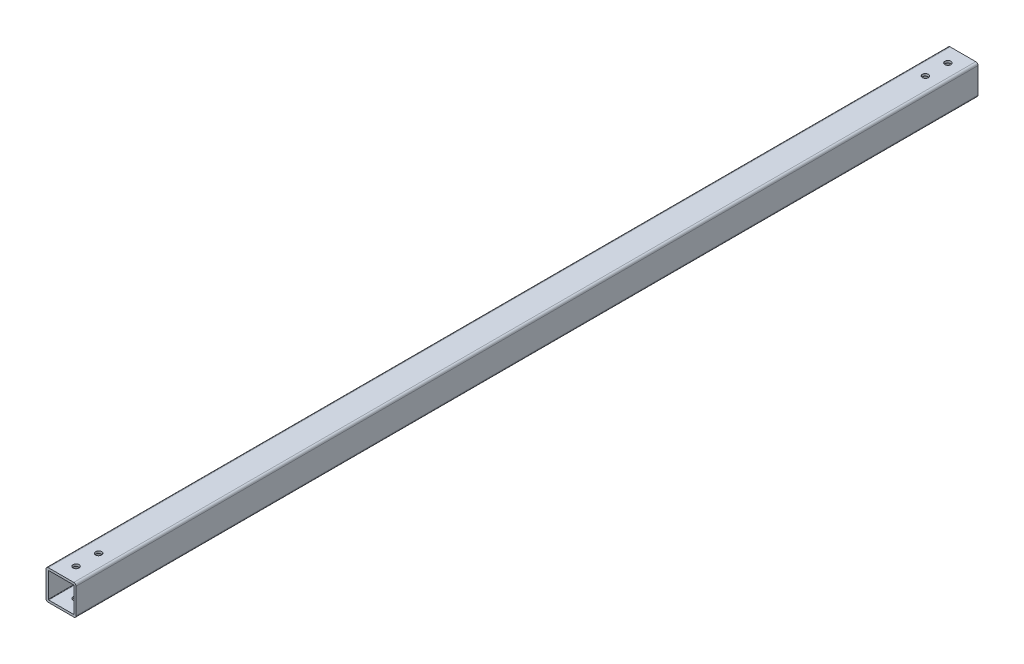
ISO-10303-21;
HEADER;
FILE_DESCRIPTION(('STEP AP214'),'2;1');
FILE_NAME('part.step','',(''),(''),'','','');
FILE_SCHEMA(('AUTOMOTIVE_DESIGN { 1 0 10303 214 1 1 1 1 }'));
ENDSEC;
DATA;
#1=APPLICATION_CONTEXT('core data for automotive mechanical design processes');
#2=APPLICATION_PROTOCOL_DEFINITION('international standard','automotive_design',2000,#1);
#3=PRODUCT_CONTEXT('',#1,'mechanical');
#4=PRODUCT('Part','Part','',(#3));
#5=PRODUCT_RELATED_PRODUCT_CATEGORY('part','',(#4));
#6=PRODUCT_DEFINITION_FORMATION('','',#4);
#7=PRODUCT_DEFINITION_CONTEXT('part definition',#1,'design');
#8=PRODUCT_DEFINITION('design','',#6,#7);
#9=PRODUCT_DEFINITION_SHAPE('','',#8);
#10=(LENGTH_UNIT() NAMED_UNIT(*) SI_UNIT(.MILLI.,.METRE.));
#11=(NAMED_UNIT(*) PLANE_ANGLE_UNIT() SI_UNIT($,.RADIAN.));
#12=(NAMED_UNIT(*) SI_UNIT($,.STERADIAN.) SOLID_ANGLE_UNIT());
#13=UNCERTAINTY_MEASURE_WITH_UNIT(LENGTH_MEASURE(1.E-05),#10,'distance_accuracy_value','');
#14=(GEOMETRIC_REPRESENTATION_CONTEXT(3) GLOBAL_UNCERTAINTY_ASSIGNED_CONTEXT((#13)) GLOBAL_UNIT_ASSIGNED_CONTEXT((#10,
#11,#12)) REPRESENTATION_CONTEXT('',''));
#15=CARTESIAN_POINT('',(0.,0.,0.));
#16=DIRECTION('',(0.,0.,1.));
#17=DIRECTION('',(1.,0.,0.));
#18=AXIS2_PLACEMENT_3D('',#15,#16,#17);
#19=CARTESIAN_POINT('',(0.,0.,1200.));
#20=DIRECTION('',(0.,0.,1.));
#21=DIRECTION('',(1.,0.,0.));
#22=AXIS2_PLACEMENT_3D('',#19,#20,#21);
#23=PLANE('',#22);
#24=DIRECTION('',(1.,0.,0.));
#25=VECTOR('',#24,1.);
#26=CARTESIAN_POINT('',(-20.0000000000001,-20.,1200.));
#27=LINE('',#26,#25);
#28=CARTESIAN_POINT('',(-17.0000000000001,-20.,1200.));
#29=VERTEX_POINT('',#28);
#30=CARTESIAN_POINT('',(17.,-20.,1200.));
#31=VERTEX_POINT('',#30);
#32=EDGE_CURVE('E210',#29,#31,#27,.T.);
#33=ORIENTED_EDGE('',*,*,#32,.T.);
#34=CARTESIAN_POINT('',(17.,-17.,1200.));
#35=DIRECTION('',(0.,0.,1.));
#36=DIRECTION('',(1.,0.,0.));
#37=AXIS2_PLACEMENT_3D('',#34,#35,#36);
#38=CIRCLE('',#37,3.);
#39=CARTESIAN_POINT('',(20.,-17.,1200.));
#40=VERTEX_POINT('',#39);
#41=EDGE_CURVE('E269',#31,#40,#38,.T.);
#42=ORIENTED_EDGE('',*,*,#41,.T.);
#43=DIRECTION('',(0.,1.,0.));
#44=VECTOR('',#43,1.);
#45=CARTESIAN_POINT('',(20.,20.,1200.));
#46=LINE('',#45,#44);
#47=CARTESIAN_POINT('',(20.,17.,1200.));
#48=VERTEX_POINT('',#47);
#49=EDGE_CURVE('E335',#40,#48,#46,.T.);
#50=ORIENTED_EDGE('',*,*,#49,.T.);
#51=CARTESIAN_POINT('',(17.,17.,1200.));
#52=DIRECTION('',(0.,0.,1.));
#53=DIRECTION('',(1.,0.,0.));
#54=AXIS2_PLACEMENT_3D('',#51,#52,#53);
#55=CIRCLE('',#54,3.);
#56=CARTESIAN_POINT('',(17.,20.,1200.));
#57=VERTEX_POINT('',#56);
#58=EDGE_CURVE('E265',#48,#57,#55,.T.);
#59=ORIENTED_EDGE('',*,*,#58,.T.);
#60=DIRECTION('',(-1.,0.,0.));
#61=VECTOR('',#60,1.);
#62=CARTESIAN_POINT('',(-20.0000000000001,20.,1200.));
#63=LINE('',#62,#61);
#64=CARTESIAN_POINT('',(-17.0000000000001,20.,1200.));
#65=VERTEX_POINT('',#64);
#66=EDGE_CURVE('E338',#57,#65,#63,.T.);
#67=ORIENTED_EDGE('',*,*,#66,.T.);
#68=CARTESIAN_POINT('',(-17.0000000000001,17.,1200.));
#69=DIRECTION('',(0.,0.,1.));
#70=DIRECTION('',(1.,0.,0.));
#71=AXIS2_PLACEMENT_3D('',#68,#69,#70);
#72=CIRCLE('',#71,3.);
#73=CARTESIAN_POINT('',(-20.0000000000001,17.,1200.));
#74=VERTEX_POINT('',#73);
#75=EDGE_CURVE('E91',#65,#74,#72,.T.);
#76=ORIENTED_EDGE('',*,*,#75,.T.);
#77=DIRECTION('',(0.,-1.,0.));
#78=VECTOR('',#77,1.);
#79=CARTESIAN_POINT('',(-20.0000000000001,20.,1200.));
#80=LINE('',#79,#78);
#81=CARTESIAN_POINT('',(-20.0000000000001,-17.,1200.));
#82=VERTEX_POINT('',#81);
#83=EDGE_CURVE('E215',#74,#82,#80,.T.);
#84=ORIENTED_EDGE('',*,*,#83,.T.);
#85=CARTESIAN_POINT('',(-17.0000000000001,-17.,1200.));
#86=DIRECTION('',(0.,0.,1.));
#87=DIRECTION('',(1.,0.,0.));
#88=AXIS2_PLACEMENT_3D('',#85,#86,#87);
#89=CIRCLE('',#88,3.);
#90=EDGE_CURVE('E267',#82,#29,#89,.T.);
#91=ORIENTED_EDGE('',*,*,#90,.T.);
#92=EDGE_LOOP('',(#33,#42,#50,#59,#67,#76,#84,#91));
#93=FACE_BOUND('',#92,.T.);
#94=DIRECTION('',(-1.,0.,0.));
#95=VECTOR('',#94,1.);
#96=CARTESIAN_POINT('',(-20.0000000000001,17.,1200.));
#97=LINE('',#96,#95);
#98=CARTESIAN_POINT('',(16.5,17.,1200.));
#99=VERTEX_POINT('',#98);
#100=CARTESIAN_POINT('',(-16.5000000000001,17.,1200.));
#101=VERTEX_POINT('',#100);
#102=EDGE_CURVE('E322',#99,#101,#97,.T.);
#103=ORIENTED_EDGE('',*,*,#102,.F.);
#104=CARTESIAN_POINT('',(16.5,16.5,1200.));
#105=DIRECTION('',(0.,0.,1.));
#106=DIRECTION('',(1.,0.,0.));
#107=AXIS2_PLACEMENT_3D('',#104,#105,#106);
#108=CIRCLE('',#107,0.5);
#109=CARTESIAN_POINT('',(17.,16.5,1200.));
#110=VERTEX_POINT('',#109);
#111=EDGE_CURVE('E240',#99,#110,#108,.F.);
#112=ORIENTED_EDGE('',*,*,#111,.T.);
#113=DIRECTION('',(0.,1.,0.));
#114=VECTOR('',#113,1.);
#115=CARTESIAN_POINT('',(17.,20.,1200.));
#116=LINE('',#115,#114);
#117=CARTESIAN_POINT('',(17.,-16.5,1200.));
#118=VERTEX_POINT('',#117);
#119=EDGE_CURVE('E319',#118,#110,#116,.T.);
#120=ORIENTED_EDGE('',*,*,#119,.F.);
#121=CARTESIAN_POINT('',(16.5,-16.5,1200.));
#122=DIRECTION('',(0.,0.,1.));
#123=DIRECTION('',(1.,0.,0.));
#124=AXIS2_PLACEMENT_3D('',#121,#122,#123);
#125=CIRCLE('',#124,0.5);
#126=CARTESIAN_POINT('',(16.5,-17.,1200.));
#127=VERTEX_POINT('',#126);
#128=EDGE_CURVE('E244',#118,#127,#125,.F.);
#129=ORIENTED_EDGE('',*,*,#128,.T.);
#130=DIRECTION('',(1.,0.,0.));
#131=VECTOR('',#130,1.);
#132=CARTESIAN_POINT('',(-20.0000000000001,-17.,1200.));
#133=LINE('',#132,#131);
#134=CARTESIAN_POINT('',(-16.5000000000001,-17.,1200.));
#135=VERTEX_POINT('',#134);
#136=EDGE_CURVE('E327',#135,#127,#133,.T.);
#137=ORIENTED_EDGE('',*,*,#136,.F.);
#138=CARTESIAN_POINT('',(-16.5000000000001,-16.5,1200.));
#139=DIRECTION('',(0.,0.,1.));
#140=DIRECTION('',(1.,0.,0.));
#141=AXIS2_PLACEMENT_3D('',#138,#139,#140);
#142=CIRCLE('',#141,0.5);
#143=CARTESIAN_POINT('',(-17.0000000000001,-16.5,1200.));
#144=VERTEX_POINT('',#143);
#145=EDGE_CURVE('E196',#135,#144,#142,.F.);
#146=ORIENTED_EDGE('',*,*,#145,.T.);
#147=DIRECTION('',(0.,-1.,0.));
#148=VECTOR('',#147,1.);
#149=CARTESIAN_POINT('',(-17.0000000000001,20.,1200.));
#150=LINE('',#149,#148);
#151=CARTESIAN_POINT('',(-17.0000000000001,16.5,1200.));
#152=VERTEX_POINT('',#151);
#153=EDGE_CURVE('E325',#152,#144,#150,.T.);
#154=ORIENTED_EDGE('',*,*,#153,.F.);
#155=CARTESIAN_POINT('',(-16.5000000000001,16.5,1200.));
#156=DIRECTION('',(0.,0.,1.));
#157=DIRECTION('',(1.,0.,0.));
#158=AXIS2_PLACEMENT_3D('',#155,#156,#157);
#159=CIRCLE('',#158,0.5);
#160=EDGE_CURVE('E195',#152,#101,#159,.F.);
#161=ORIENTED_EDGE('',*,*,#160,.T.);
#162=EDGE_LOOP('',(#103,#112,#120,#129,#137,#146,#154,#161));
#163=FACE_BOUND('',#162,.T.);
#164=ADVANCED_FACE('F67',(#93,#163),#23,.T.);
#165=CARTESIAN_POINT('',(0.,0.,0.));
#166=DIRECTION('',(0.,0.,1.));
#167=DIRECTION('',(1.,0.,0.));
#168=AXIS2_PLACEMENT_3D('',#165,#166,#167);
#169=PLANE('',#168);
#170=DIRECTION('',(0.,1.,0.));
#171=VECTOR('',#170,1.);
#172=CARTESIAN_POINT('',(20.,20.,0.));
#173=LINE('',#172,#171);
#174=CARTESIAN_POINT('',(20.,-17.,0.));
#175=VERTEX_POINT('',#174);
#176=CARTESIAN_POINT('',(20.,17.,0.));
#177=VERTEX_POINT('',#176);
#178=EDGE_CURVE('E330',#175,#177,#173,.T.);
#179=ORIENTED_EDGE('',*,*,#178,.F.);
#180=CARTESIAN_POINT('',(17.,-17.,0.));
#181=DIRECTION('',(0.,0.,1.));
#182=DIRECTION('',(1.,0.,0.));
#183=AXIS2_PLACEMENT_3D('',#180,#181,#182);
#184=CIRCLE('',#183,3.);
#185=CARTESIAN_POINT('',(17.,-20.,0.));
#186=VERTEX_POINT('',#185);
#187=EDGE_CURVE('E257',#175,#186,#184,.F.);
#188=ORIENTED_EDGE('',*,*,#187,.T.);
#189=DIRECTION('',(1.,0.,0.));
#190=VECTOR('',#189,1.);
#191=CARTESIAN_POINT('',(-20.,-20.,0.));
#192=LINE('',#191,#190);
#193=CARTESIAN_POINT('',(-17.,-20.,0.));
#194=VERTEX_POINT('',#193);
#195=EDGE_CURVE('E218',#194,#186,#192,.T.);
#196=ORIENTED_EDGE('',*,*,#195,.F.);
#197=CARTESIAN_POINT('',(-17.,-17.,0.));
#198=DIRECTION('',(0.,0.,1.));
#199=DIRECTION('',(1.,0.,0.));
#200=AXIS2_PLACEMENT_3D('',#197,#198,#199);
#201=CIRCLE('',#200,3.);
#202=CARTESIAN_POINT('',(-20.,-17.,0.));
#203=VERTEX_POINT('',#202);
#204=EDGE_CURVE('E255',#194,#203,#201,.F.);
#205=ORIENTED_EDGE('',*,*,#204,.T.);
#206=DIRECTION('',(0.,-1.,0.));
#207=VECTOR('',#206,1.);
#208=CARTESIAN_POINT('',(-20.,20.,0.));
#209=LINE('',#208,#207);
#210=CARTESIAN_POINT('',(-20.,17.,0.));
#211=VERTEX_POINT('',#210);
#212=EDGE_CURVE('E345',#211,#203,#209,.T.);
#213=ORIENTED_EDGE('',*,*,#212,.F.);
#214=CARTESIAN_POINT('',(-17.,17.,0.));
#215=DIRECTION('',(0.,0.,1.));
#216=DIRECTION('',(1.,0.,0.));
#217=AXIS2_PLACEMENT_3D('',#214,#215,#216);
#218=CIRCLE('',#217,3.);
#219=CARTESIAN_POINT('',(-17.,20.,0.));
#220=VERTEX_POINT('',#219);
#221=EDGE_CURVE('E251',#211,#220,#218,.F.);
#222=ORIENTED_EDGE('',*,*,#221,.T.);
#223=DIRECTION('',(-1.,0.,0.));
#224=VECTOR('',#223,1.);
#225=CARTESIAN_POINT('',(-20.,20.,0.));
#226=LINE('',#225,#224);
#227=CARTESIAN_POINT('',(17.,20.,0.));
#228=VERTEX_POINT('',#227);
#229=EDGE_CURVE('E343',#228,#220,#226,.T.);
#230=ORIENTED_EDGE('',*,*,#229,.F.);
#231=CARTESIAN_POINT('',(17.,17.,0.));
#232=DIRECTION('',(0.,0.,1.));
#233=DIRECTION('',(1.,0.,0.));
#234=AXIS2_PLACEMENT_3D('',#231,#232,#233);
#235=CIRCLE('',#234,3.);
#236=EDGE_CURVE('E253',#228,#177,#235,.F.);
#237=ORIENTED_EDGE('',*,*,#236,.T.);
#238=EDGE_LOOP('',(#179,#188,#196,#205,#213,#222,#230,#237));
#239=FACE_BOUND('',#238,.T.);
#240=DIRECTION('',(1.,0.,0.));
#241=VECTOR('',#240,1.);
#242=CARTESIAN_POINT('',(-20.,-17.,0.));
#243=LINE('',#242,#241);
#244=CARTESIAN_POINT('',(-16.5,-17.,0.));
#245=VERTEX_POINT('',#244);
#246=CARTESIAN_POINT('',(16.5,-17.,0.));
#247=VERTEX_POINT('',#246);
#248=EDGE_CURVE('E206',#245,#247,#243,.T.);
#249=ORIENTED_EDGE('',*,*,#248,.T.);
#250=CARTESIAN_POINT('',(16.5,-16.5,0.));
#251=DIRECTION('',(0.,0.,1.));
#252=DIRECTION('',(1.,0.,0.));
#253=AXIS2_PLACEMENT_3D('',#250,#251,#252);
#254=CIRCLE('',#253,0.5);
#255=CARTESIAN_POINT('',(17.,-16.5,0.));
#256=VERTEX_POINT('',#255);
#257=EDGE_CURVE('E242',#247,#256,#254,.T.);
#258=ORIENTED_EDGE('',*,*,#257,.T.);
#259=DIRECTION('',(0.,1.,0.));
#260=VECTOR('',#259,1.);
#261=CARTESIAN_POINT('',(17.,20.,0.));
#262=LINE('',#261,#260);
#263=CARTESIAN_POINT('',(17.,16.5,0.));
#264=VERTEX_POINT('',#263);
#265=EDGE_CURVE('E318',#256,#264,#262,.T.);
#266=ORIENTED_EDGE('',*,*,#265,.T.);
#267=CARTESIAN_POINT('',(16.5,16.5,0.));
#268=DIRECTION('',(0.,0.,1.));
#269=DIRECTION('',(1.,0.,0.));
#270=AXIS2_PLACEMENT_3D('',#267,#268,#269);
#271=CIRCLE('',#270,0.5);
#272=CARTESIAN_POINT('',(16.5,17.,0.));
#273=VERTEX_POINT('',#272);
#274=EDGE_CURVE('E238',#264,#273,#271,.T.);
#275=ORIENTED_EDGE('',*,*,#274,.T.);
#276=DIRECTION('',(-1.,0.,0.));
#277=VECTOR('',#276,1.);
#278=CARTESIAN_POINT('',(-20.,17.,0.));
#279=LINE('',#278,#277);
#280=CARTESIAN_POINT('',(-16.5,17.,0.));
#281=VERTEX_POINT('',#280);
#282=EDGE_CURVE('E190',#273,#281,#279,.T.);
#283=ORIENTED_EDGE('',*,*,#282,.T.);
#284=CARTESIAN_POINT('',(-16.5,16.5,0.));
#285=DIRECTION('',(0.,0.,1.));
#286=DIRECTION('',(1.,0.,0.));
#287=AXIS2_PLACEMENT_3D('',#284,#285,#286);
#288=CIRCLE('',#287,0.5);
#289=CARTESIAN_POINT('',(-17.,16.5,0.));
#290=VERTEX_POINT('',#289);
#291=EDGE_CURVE('E184',#281,#290,#288,.T.);
#292=ORIENTED_EDGE('',*,*,#291,.T.);
#293=DIRECTION('',(0.,-1.,0.));
#294=VECTOR('',#293,1.);
#295=CARTESIAN_POINT('',(-17.,20.,0.));
#296=LINE('',#295,#294);
#297=CARTESIAN_POINT('',(-17.,-16.5,0.));
#298=VERTEX_POINT('',#297);
#299=EDGE_CURVE('E188',#290,#298,#296,.T.);
#300=ORIENTED_EDGE('',*,*,#299,.T.);
#301=CARTESIAN_POINT('',(-16.5,-16.5,0.));
#302=DIRECTION('',(0.,0.,1.));
#303=DIRECTION('',(1.,0.,0.));
#304=AXIS2_PLACEMENT_3D('',#301,#302,#303);
#305=CIRCLE('',#304,0.5);
#306=EDGE_CURVE('E234',#298,#245,#305,.T.);
#307=ORIENTED_EDGE('',*,*,#306,.T.);
#308=EDGE_LOOP('',(#249,#258,#266,#275,#283,#292,#300,#307));
#309=FACE_BOUND('',#308,.T.);
#310=ADVANCED_FACE('F187',(#239,#309),#169,.F.);
#311=CARTESIAN_POINT('',(20.,20.,1200.));
#312=DIRECTION('',(-1.,0.,0.));
#313=DIRECTION('',(0.,-1.,0.));
#314=AXIS2_PLACEMENT_3D('',#311,#312,#313);
#315=PLANE('',#314);
#316=ORIENTED_EDGE('',*,*,#49,.F.);
#317=DIRECTION('',(0.,0.,-1.));
#318=VECTOR('',#317,1.);
#319=CARTESIAN_POINT('',(20.,-17.,1200.));
#320=LINE('',#319,#318);
#321=EDGE_CURVE('E248',#40,#175,#320,.T.);
#322=ORIENTED_EDGE('',*,*,#321,.T.);
#323=ORIENTED_EDGE('',*,*,#178,.T.);
#324=DIRECTION('',(0.,0.,-1.));
#325=VECTOR('',#324,1.);
#326=CARTESIAN_POINT('',(20.,17.,1200.));
#327=LINE('',#326,#325);
#328=EDGE_CURVE('E246',#177,#48,#327,.F.);
#329=ORIENTED_EDGE('',*,*,#328,.T.);
#330=EDGE_LOOP('',(#316,#322,#323,#329));
#331=FACE_BOUND('',#330,.T.);
#332=ADVANCED_FACE('F363',(#331),#315,.F.);
#333=CARTESIAN_POINT('',(-20.0000000000001,20.,1200.));
#334=DIRECTION('',(0.,-1.,0.));
#335=DIRECTION('',(0.,0.,-1.));
#336=AXIS2_PLACEMENT_3D('',#333,#334,#335);
#337=PLANE('',#336);
#338=CARTESIAN_POINT('',(0.,20.,50.));
#339=DIRECTION('',(0.,1.,0.));
#340=DIRECTION('',(0.,0.,-1.));
#341=AXIS2_PLACEMENT_3D('',#338,#339,#340);
#342=CIRCLE('',#341,4.);
#343=CARTESIAN_POINT('',(0.,20.,46.));
#344=VERTEX_POINT('',#343);
#345=EDGE_CURVE('E485',#344,#344,#342,.T.);
#346=ORIENTED_EDGE('',*,*,#345,.F.);
#347=EDGE_LOOP('',(#346));
#348=FACE_BOUND('',#347,.T.);
#349=CARTESIAN_POINT('',(0.,20.,1150.));
#350=DIRECTION('',(0.,1.,0.));
#351=DIRECTION('',(0.,0.,1.));
#352=AXIS2_PLACEMENT_3D('',#349,#350,#351);
#353=CIRCLE('',#352,4.);
#354=CARTESIAN_POINT('',(0.,20.,1154.));
#355=VERTEX_POINT('',#354);
#356=EDGE_CURVE('E295',#355,#355,#353,.T.);
#357=ORIENTED_EDGE('',*,*,#356,.F.);
#358=EDGE_LOOP('',(#357));
#359=FACE_BOUND('',#358,.T.);
#360=CARTESIAN_POINT('',(0.,20.,1180.));
#361=DIRECTION('',(0.,1.,0.));
#362=DIRECTION('',(0.,0.,1.));
#363=AXIS2_PLACEMENT_3D('',#360,#361,#362);
#364=CIRCLE('',#363,3.99999999999999);
#365=CARTESIAN_POINT('',(0.,20.,1184.));
#366=VERTEX_POINT('',#365);
#367=EDGE_CURVE('E292',#366,#366,#364,.T.);
#368=ORIENTED_EDGE('',*,*,#367,.F.);
#369=EDGE_LOOP('',(#368));
#370=FACE_BOUND('',#369,.T.);
#371=CARTESIAN_POINT('',(0.,20.,20.));
#372=DIRECTION('',(0.,1.,0.));
#373=DIRECTION('',(0.,0.,1.));
#374=AXIS2_PLACEMENT_3D('',#371,#372,#373);
#375=CIRCLE('',#374,3.99999999999999);
#376=CARTESIAN_POINT('',(0.,20.,24.));
#377=VERTEX_POINT('',#376);
#378=EDGE_CURVE('E311',#377,#377,#375,.T.);
#379=ORIENTED_EDGE('',*,*,#378,.F.);
#380=EDGE_LOOP('',(#379));
#381=FACE_BOUND('',#380,.T.);
#382=ORIENTED_EDGE('',*,*,#66,.F.);
#383=DIRECTION('',(0.,0.,-1.));
#384=VECTOR('',#383,1.);
#385=CARTESIAN_POINT('',(17.,20.,1200.));
#386=LINE('',#385,#384);
#387=EDGE_CURVE('E14',#57,#228,#386,.T.);
#388=ORIENTED_EDGE('',*,*,#387,.T.);
#389=ORIENTED_EDGE('',*,*,#229,.T.);
#390=DIRECTION('',(0.,0.,-1.));
#391=VECTOR('',#390,1.);
#392=CARTESIAN_POINT('',(-17.0000000000001,20.,1200.));
#393=LINE('',#392,#391);
#394=EDGE_CURVE('E76',#220,#65,#393,.F.);
#395=ORIENTED_EDGE('',*,*,#394,.T.);
#396=EDGE_LOOP('',(#382,#388,#389,#395));
#397=FACE_BOUND('',#396,.T.);
#398=ADVANCED_FACE('F371',(#348,#359,#370,#381,#397),#337,.F.);
#399=CARTESIAN_POINT('',(-20.0000000000001,20.,1200.));
#400=DIRECTION('',(1.,0.,0.));
#401=DIRECTION('',(0.,1.,0.));
#402=AXIS2_PLACEMENT_3D('',#399,#400,#401);
#403=PLANE('',#402);
#404=ORIENTED_EDGE('',*,*,#212,.T.);
#405=DIRECTION('',(0.,0.,-1.));
#406=VECTOR('',#405,1.);
#407=CARTESIAN_POINT('',(-20.0000000000001,-17.,1200.));
#408=LINE('',#407,#406);
#409=EDGE_CURVE('E84',#203,#82,#408,.F.);
#410=ORIENTED_EDGE('',*,*,#409,.T.);
#411=ORIENTED_EDGE('',*,*,#83,.F.);
#412=DIRECTION('',(0.,0.,-1.));
#413=VECTOR('',#412,1.);
#414=CARTESIAN_POINT('',(-20.0000000000001,17.,1200.));
#415=LINE('',#414,#413);
#416=EDGE_CURVE('E271',#74,#211,#415,.T.);
#417=ORIENTED_EDGE('',*,*,#416,.T.);
#418=EDGE_LOOP('',(#404,#410,#411,#417));
#419=FACE_BOUND('',#418,.T.);
#420=ADVANCED_FACE('F376',(#419),#403,.F.);
#421=CARTESIAN_POINT('',(-20.0000000000001,-20.,1200.));
#422=DIRECTION('',(0.,1.,0.));
#423=DIRECTION('',(0.,0.,1.));
#424=AXIS2_PLACEMENT_3D('',#421,#422,#423);
#425=PLANE('',#424);
#426=CARTESIAN_POINT('',(0.,-20.,50.));
#427=DIRECTION('',(0.,1.,0.));
#428=DIRECTION('',(0.,0.,-1.));
#429=AXIS2_PLACEMENT_3D('',#426,#427,#428);
#430=CIRCLE('',#429,4.);
#431=CARTESIAN_POINT('',(0.,-20.,46.));
#432=VERTEX_POINT('',#431);
#433=EDGE_CURVE('E484',#432,#432,#430,.T.);
#434=ORIENTED_EDGE('',*,*,#433,.T.);
#435=EDGE_LOOP('',(#434));
#436=FACE_BOUND('',#435,.T.);
#437=CARTESIAN_POINT('',(0.,-20.,1150.));
#438=DIRECTION('',(0.,1.,0.));
#439=DIRECTION('',(0.,0.,1.));
#440=AXIS2_PLACEMENT_3D('',#437,#438,#439);
#441=CIRCLE('',#440,4.);
#442=CARTESIAN_POINT('',(0.,-20.,1154.));
#443=VERTEX_POINT('',#442);
#444=EDGE_CURVE('E288',#443,#443,#441,.T.);
#445=ORIENTED_EDGE('',*,*,#444,.T.);
#446=EDGE_LOOP('',(#445));
#447=FACE_BOUND('',#446,.T.);
#448=CARTESIAN_POINT('',(0.,-20.,1180.));
#449=DIRECTION('',(0.,1.,0.));
#450=DIRECTION('',(0.,0.,1.));
#451=AXIS2_PLACEMENT_3D('',#448,#449,#450);
#452=CIRCLE('',#451,3.99999999999999);
#453=CARTESIAN_POINT('',(0.,-20.,1184.));
#454=VERTEX_POINT('',#453);
#455=EDGE_CURVE('E284',#454,#454,#452,.T.);
#456=ORIENTED_EDGE('',*,*,#455,.T.);
#457=EDGE_LOOP('',(#456));
#458=FACE_BOUND('',#457,.T.);
#459=CARTESIAN_POINT('',(0.,-20.,20.));
#460=DIRECTION('',(0.,1.,0.));
#461=DIRECTION('',(0.,0.,1.));
#462=AXIS2_PLACEMENT_3D('',#459,#460,#461);
#463=CIRCLE('',#462,3.99999999999999);
#464=CARTESIAN_POINT('',(0.,-20.,24.));
#465=VERTEX_POINT('',#464);
#466=EDGE_CURVE('E280',#465,#465,#463,.T.);
#467=ORIENTED_EDGE('',*,*,#466,.T.);
#468=EDGE_LOOP('',(#467));
#469=FACE_BOUND('',#468,.T.);
#470=ORIENTED_EDGE('',*,*,#195,.T.);
#471=DIRECTION('',(0.,0.,-1.));
#472=VECTOR('',#471,1.);
#473=CARTESIAN_POINT('',(17.,-20.,1200.));
#474=LINE('',#473,#472);
#475=EDGE_CURVE('E262',#186,#31,#474,.F.);
#476=ORIENTED_EDGE('',*,*,#475,.T.);
#477=ORIENTED_EDGE('',*,*,#32,.F.);
#478=DIRECTION('',(0.,0.,-1.));
#479=VECTOR('',#478,1.);
#480=CARTESIAN_POINT('',(-17.0000000000001,-20.,1200.));
#481=LINE('',#480,#479);
#482=EDGE_CURVE('E259',#29,#194,#481,.T.);
#483=ORIENTED_EDGE('',*,*,#482,.T.);
#484=EDGE_LOOP('',(#470,#476,#477,#483));
#485=FACE_BOUND('',#484,.T.);
#486=ADVANCED_FACE('F351',(#436,#447,#458,#469,#485),#425,.F.);
#487=CARTESIAN_POINT('',(17.,20.,1200.));
#488=DIRECTION('',(-1.,0.,0.));
#489=DIRECTION('',(0.,-1.,0.));
#490=AXIS2_PLACEMENT_3D('',#487,#488,#489);
#491=PLANE('',#490);
#492=ORIENTED_EDGE('',*,*,#119,.T.);
#493=DIRECTION('',(0.,0.,-1.));
#494=VECTOR('',#493,1.);
#495=CARTESIAN_POINT('',(17.,16.5,0.));
#496=LINE('',#495,#494);
#497=EDGE_CURVE('E231',#110,#264,#496,.T.);
#498=ORIENTED_EDGE('',*,*,#497,.T.);
#499=ORIENTED_EDGE('',*,*,#265,.F.);
#500=DIRECTION('',(0.,0.,-1.));
#501=VECTOR('',#500,1.);
#502=CARTESIAN_POINT('',(17.,-16.5,1200.));
#503=LINE('',#502,#501);
#504=EDGE_CURVE('E229',#256,#118,#503,.F.);
#505=ORIENTED_EDGE('',*,*,#504,.T.);
#506=EDGE_LOOP('',(#492,#498,#499,#505));
#507=FACE_BOUND('',#506,.T.);
#508=ADVANCED_FACE('F395',(#507),#491,.T.);
#509=CARTESIAN_POINT('',(-20.0000000000001,17.,1200.));
#510=DIRECTION('',(0.,-1.,0.));
#511=DIRECTION('',(0.,0.,-1.));
#512=AXIS2_PLACEMENT_3D('',#509,#510,#511);
#513=PLANE('',#512);
#514=CARTESIAN_POINT('',(0.,17.,50.));
#515=DIRECTION('',(0.,-1.,0.));
#516=DIRECTION('',(0.,0.,-1.));
#517=AXIS2_PLACEMENT_3D('',#514,#515,#516);
#518=CIRCLE('',#517,4.);
#519=CARTESIAN_POINT('',(0.,17.,46.));
#520=VERTEX_POINT('',#519);
#521=EDGE_CURVE('E300',#520,#520,#518,.T.);
#522=ORIENTED_EDGE('',*,*,#521,.F.);
#523=EDGE_LOOP('',(#522));
#524=FACE_BOUND('',#523,.T.);
#525=CARTESIAN_POINT('',(0.,17.,1150.));
#526=DIRECTION('',(0.,-1.,0.));
#527=DIRECTION('',(0.,0.,-1.));
#528=AXIS2_PLACEMENT_3D('',#525,#526,#527);
#529=CIRCLE('',#528,4.);
#530=CARTESIAN_POINT('',(0.,17.,1146.));
#531=VERTEX_POINT('',#530);
#532=EDGE_CURVE('E287',#531,#531,#529,.T.);
#533=ORIENTED_EDGE('',*,*,#532,.F.);
#534=EDGE_LOOP('',(#533));
#535=FACE_BOUND('',#534,.T.);
#536=CARTESIAN_POINT('',(0.,17.,1180.));
#537=DIRECTION('',(0.,-1.,0.));
#538=DIRECTION('',(0.,0.,-1.));
#539=AXIS2_PLACEMENT_3D('',#536,#537,#538);
#540=CIRCLE('',#539,3.99999999999999);
#541=CARTESIAN_POINT('',(0.,17.,1176.));
#542=VERTEX_POINT('',#541);
#543=EDGE_CURVE('E283',#542,#542,#540,.T.);
#544=ORIENTED_EDGE('',*,*,#543,.F.);
#545=EDGE_LOOP('',(#544));
#546=FACE_BOUND('',#545,.T.);
#547=CARTESIAN_POINT('',(0.,17.,20.));
#548=DIRECTION('',(0.,-1.,0.));
#549=DIRECTION('',(0.,0.,-1.));
#550=AXIS2_PLACEMENT_3D('',#547,#548,#549);
#551=CIRCLE('',#550,3.99999999999999);
#552=CARTESIAN_POINT('',(0.,17.,16.));
#553=VERTEX_POINT('',#552);
#554=EDGE_CURVE('E279',#553,#553,#551,.T.);
#555=ORIENTED_EDGE('',*,*,#554,.F.);
#556=EDGE_LOOP('',(#555));
#557=FACE_BOUND('',#556,.T.);
#558=ORIENTED_EDGE('',*,*,#102,.T.);
#559=DIRECTION('',(0.,0.,-1.));
#560=VECTOR('',#559,1.);
#561=CARTESIAN_POINT('',(-16.5,17.,0.));
#562=LINE('',#561,#560);
#563=EDGE_CURVE('E227',#101,#281,#562,.T.);
#564=ORIENTED_EDGE('',*,*,#563,.T.);
#565=ORIENTED_EDGE('',*,*,#282,.F.);
#566=DIRECTION('',(0.,0.,-1.));
#567=VECTOR('',#566,1.);
#568=CARTESIAN_POINT('',(16.5,17.,1200.));
#569=LINE('',#568,#567);
#570=EDGE_CURVE('E225',#273,#99,#569,.F.);
#571=ORIENTED_EDGE('',*,*,#570,.T.);
#572=EDGE_LOOP('',(#558,#564,#565,#571));
#573=FACE_BOUND('',#572,.T.);
#574=ADVANCED_FACE('F435',(#524,#535,#546,#557,#573),#513,.T.);
#575=CARTESIAN_POINT('',(-17.0000000000001,20.,1200.));
#576=DIRECTION('',(1.,0.,0.));
#577=DIRECTION('',(0.,1.,0.));
#578=AXIS2_PLACEMENT_3D('',#575,#576,#577);
#579=PLANE('',#578);
#580=ORIENTED_EDGE('',*,*,#153,.T.);
#581=DIRECTION('',(0.,0.,-1.));
#582=VECTOR('',#581,1.);
#583=CARTESIAN_POINT('',(-17.,-16.5,0.));
#584=LINE('',#583,#582);
#585=EDGE_CURVE('E205',#144,#298,#584,.T.);
#586=ORIENTED_EDGE('',*,*,#585,.T.);
#587=ORIENTED_EDGE('',*,*,#299,.F.);
#588=DIRECTION('',(0.,0.,-1.));
#589=VECTOR('',#588,1.);
#590=CARTESIAN_POINT('',(-17.0000000000001,16.5,1200.));
#591=LINE('',#590,#589);
#592=EDGE_CURVE('E202',#290,#152,#591,.F.);
#593=ORIENTED_EDGE('',*,*,#592,.T.);
#594=EDGE_LOOP('',(#580,#586,#587,#593));
#595=FACE_BOUND('',#594,.T.);
#596=ADVANCED_FACE('F201',(#595),#579,.T.);
#597=CARTESIAN_POINT('',(-20.0000000000001,-17.,1200.));
#598=DIRECTION('',(0.,1.,0.));
#599=DIRECTION('',(0.,0.,1.));
#600=AXIS2_PLACEMENT_3D('',#597,#598,#599);
#601=PLANE('',#600);
#602=CARTESIAN_POINT('',(0.,-17.,50.));
#603=DIRECTION('',(0.,1.,0.));
#604=DIRECTION('',(0.,0.,1.));
#605=AXIS2_PLACEMENT_3D('',#602,#603,#604);
#606=CIRCLE('',#605,4.);
#607=CARTESIAN_POINT('',(0.,-17.,54.0000000000001));
#608=VERTEX_POINT('',#607);
#609=EDGE_CURVE('E71',#608,#608,#606,.T.);
#610=ORIENTED_EDGE('',*,*,#609,.F.);
#611=EDGE_LOOP('',(#610));
#612=FACE_BOUND('',#611,.T.);
#613=CARTESIAN_POINT('',(0.,-17.,1150.));
#614=DIRECTION('',(0.,1.,0.));
#615=DIRECTION('',(0.,0.,1.));
#616=AXIS2_PLACEMENT_3D('',#613,#614,#615);
#617=CIRCLE('',#616,4.);
#618=CARTESIAN_POINT('',(0.,-17.,1154.));
#619=VERTEX_POINT('',#618);
#620=EDGE_CURVE('E285',#619,#619,#617,.T.);
#621=ORIENTED_EDGE('',*,*,#620,.F.);
#622=EDGE_LOOP('',(#621));
#623=FACE_BOUND('',#622,.T.);
#624=CARTESIAN_POINT('',(0.,-17.,1180.));
#625=DIRECTION('',(0.,1.,0.));
#626=DIRECTION('',(0.,0.,1.));
#627=AXIS2_PLACEMENT_3D('',#624,#625,#626);
#628=CIRCLE('',#627,3.99999999999999);
#629=CARTESIAN_POINT('',(0.,-17.,1184.));
#630=VERTEX_POINT('',#629);
#631=EDGE_CURVE('E281',#630,#630,#628,.T.);
#632=ORIENTED_EDGE('',*,*,#631,.F.);
#633=EDGE_LOOP('',(#632));
#634=FACE_BOUND('',#633,.T.);
#635=CARTESIAN_POINT('',(0.,-17.,20.));
#636=DIRECTION('',(0.,1.,0.));
#637=DIRECTION('',(0.,0.,1.));
#638=AXIS2_PLACEMENT_3D('',#635,#636,#637);
#639=CIRCLE('',#638,3.99999999999999);
#640=CARTESIAN_POINT('',(0.,-17.,24.));
#641=VERTEX_POINT('',#640);
#642=EDGE_CURVE('E276',#641,#641,#639,.T.);
#643=ORIENTED_EDGE('',*,*,#642,.F.);
#644=EDGE_LOOP('',(#643));
#645=FACE_BOUND('',#644,.T.);
#646=ORIENTED_EDGE('',*,*,#248,.F.);
#647=DIRECTION('',(0.,0.,-1.));
#648=VECTOR('',#647,1.);
#649=CARTESIAN_POINT('',(-16.5000000000001,-17.,1200.));
#650=LINE('',#649,#648);
#651=EDGE_CURVE('E223',#245,#135,#650,.F.);
#652=ORIENTED_EDGE('',*,*,#651,.T.);
#653=ORIENTED_EDGE('',*,*,#136,.T.);
#654=DIRECTION('',(0.,0.,-1.));
#655=VECTOR('',#654,1.);
#656=CARTESIAN_POINT('',(16.5,-17.,0.));
#657=LINE('',#656,#655);
#658=EDGE_CURVE('E212',#127,#247,#657,.T.);
#659=ORIENTED_EDGE('',*,*,#658,.T.);
#660=EDGE_LOOP('',(#646,#652,#653,#659));
#661=FACE_BOUND('',#660,.T.);
#662=ADVANCED_FACE('F411',(#612,#623,#634,#645,#661),#601,.T.);
#663=CARTESIAN_POINT('',(-16.5000000000001,-16.5,1200.));
#664=DIRECTION('',(0.,0.,1.));
#665=DIRECTION('',(1.,0.,0.));
#666=AXIS2_PLACEMENT_3D('',#663,#664,#665);
#667=CYLINDRICAL_SURFACE('',#666,0.5);
#668=ORIENTED_EDGE('',*,*,#145,.F.);
#669=ORIENTED_EDGE('',*,*,#651,.F.);
#670=ORIENTED_EDGE('',*,*,#306,.F.);
#671=ORIENTED_EDGE('',*,*,#585,.F.);
#672=EDGE_LOOP('',(#668,#669,#670,#671));
#673=FACE_BOUND('',#672,.T.);
#674=ADVANCED_FACE('F408',(#673),#667,.F.);
#675=CARTESIAN_POINT('',(-16.5000000000001,16.5,1200.));
#676=DIRECTION('',(0.,0.,1.));
#677=DIRECTION('',(1.,0.,0.));
#678=AXIS2_PLACEMENT_3D('',#675,#676,#677);
#679=CYLINDRICAL_SURFACE('',#678,0.5);
#680=ORIENTED_EDGE('',*,*,#160,.F.);
#681=ORIENTED_EDGE('',*,*,#592,.F.);
#682=ORIENTED_EDGE('',*,*,#291,.F.);
#683=ORIENTED_EDGE('',*,*,#563,.F.);
#684=EDGE_LOOP('',(#680,#681,#682,#683));
#685=FACE_BOUND('',#684,.T.);
#686=ADVANCED_FACE('F209',(#685),#679,.F.);
#687=CARTESIAN_POINT('',(16.5,16.5,1200.));
#688=DIRECTION('',(0.,0.,1.));
#689=DIRECTION('',(1.,0.,0.));
#690=AXIS2_PLACEMENT_3D('',#687,#688,#689);
#691=CYLINDRICAL_SURFACE('',#690,0.5);
#692=ORIENTED_EDGE('',*,*,#111,.F.);
#693=ORIENTED_EDGE('',*,*,#570,.F.);
#694=ORIENTED_EDGE('',*,*,#274,.F.);
#695=ORIENTED_EDGE('',*,*,#497,.F.);
#696=EDGE_LOOP('',(#692,#693,#694,#695));
#697=FACE_BOUND('',#696,.T.);
#698=ADVANCED_FACE('F415',(#697),#691,.F.);
#699=CARTESIAN_POINT('',(16.5,-16.5,1200.));
#700=DIRECTION('',(0.,0.,1.));
#701=DIRECTION('',(1.,0.,0.));
#702=AXIS2_PLACEMENT_3D('',#699,#700,#701);
#703=CYLINDRICAL_SURFACE('',#702,0.5);
#704=ORIENTED_EDGE('',*,*,#128,.F.);
#705=ORIENTED_EDGE('',*,*,#504,.F.);
#706=ORIENTED_EDGE('',*,*,#257,.F.);
#707=ORIENTED_EDGE('',*,*,#658,.F.);
#708=EDGE_LOOP('',(#704,#705,#706,#707));
#709=FACE_BOUND('',#708,.T.);
#710=ADVANCED_FACE('F386',(#709),#703,.F.);
#711=CARTESIAN_POINT('',(17.,-17.,1200.));
#712=DIRECTION('',(0.,0.,-1.));
#713=DIRECTION('',(-1.,0.,0.));
#714=AXIS2_PLACEMENT_3D('',#711,#712,#713);
#715=CYLINDRICAL_SURFACE('',#714,3.);
#716=ORIENTED_EDGE('',*,*,#41,.F.);
#717=ORIENTED_EDGE('',*,*,#475,.F.);
#718=ORIENTED_EDGE('',*,*,#187,.F.);
#719=ORIENTED_EDGE('',*,*,#321,.F.);
#720=EDGE_LOOP('',(#716,#717,#718,#719));
#721=FACE_BOUND('',#720,.T.);
#722=ADVANCED_FACE('F357',(#721),#715,.T.);
#723=CARTESIAN_POINT('',(-17.0000000000001,-17.,1200.));
#724=DIRECTION('',(0.,0.,-1.));
#725=DIRECTION('',(-1.,0.,0.));
#726=AXIS2_PLACEMENT_3D('',#723,#724,#725);
#727=CYLINDRICAL_SURFACE('',#726,3.);
#728=ORIENTED_EDGE('',*,*,#90,.F.);
#729=ORIENTED_EDGE('',*,*,#409,.F.);
#730=ORIENTED_EDGE('',*,*,#204,.F.);
#731=ORIENTED_EDGE('',*,*,#482,.F.);
#732=EDGE_LOOP('',(#728,#729,#730,#731));
#733=FACE_BOUND('',#732,.T.);
#734=ADVANCED_FACE('F379',(#733),#727,.T.);
#735=CARTESIAN_POINT('',(17.,17.,1200.));
#736=DIRECTION('',(0.,0.,-1.));
#737=DIRECTION('',(-1.,0.,0.));
#738=AXIS2_PLACEMENT_3D('',#735,#736,#737);
#739=CYLINDRICAL_SURFACE('',#738,3.);
#740=ORIENTED_EDGE('',*,*,#58,.F.);
#741=ORIENTED_EDGE('',*,*,#328,.F.);
#742=ORIENTED_EDGE('',*,*,#236,.F.);
#743=ORIENTED_EDGE('',*,*,#387,.F.);
#744=EDGE_LOOP('',(#740,#741,#742,#743));
#745=FACE_BOUND('',#744,.T.);
#746=ADVANCED_FACE('F367',(#745),#739,.T.);
#747=CARTESIAN_POINT('',(-17.0000000000001,17.,1200.));
#748=DIRECTION('',(0.,0.,-1.));
#749=DIRECTION('',(-1.,0.,0.));
#750=AXIS2_PLACEMENT_3D('',#747,#748,#749);
#751=CYLINDRICAL_SURFACE('',#750,3.);
#752=ORIENTED_EDGE('',*,*,#75,.F.);
#753=ORIENTED_EDGE('',*,*,#394,.F.);
#754=ORIENTED_EDGE('',*,*,#221,.F.);
#755=ORIENTED_EDGE('',*,*,#416,.F.);
#756=EDGE_LOOP('',(#752,#753,#754,#755));
#757=FACE_BOUND('',#756,.T.);
#758=ADVANCED_FACE('F69',(#757),#751,.T.);
#759=CARTESIAN_POINT('',(0.,20.,20.));
#760=DIRECTION('',(0.,1.,0.));
#761=DIRECTION('',(0.,0.,1.));
#762=AXIS2_PLACEMENT_3D('',#759,#760,#761);
#763=CYLINDRICAL_SURFACE('',#762,3.99999999999999);
#764=ORIENTED_EDGE('',*,*,#642,.T.);
#765=EDGE_LOOP('',(#764));
#766=FACE_BOUND('',#765,.T.);
#767=ORIENTED_EDGE('',*,*,#466,.F.);
#768=EDGE_LOOP('',(#767));
#769=FACE_BOUND('',#768,.T.);
#770=ADVANCED_FACE('F455',(#766,#769),#763,.F.);
#771=ORIENTED_EDGE('',*,*,#554,.T.);
#772=EDGE_LOOP('',(#771));
#773=FACE_BOUND('',#772,.T.);
#774=ORIENTED_EDGE('',*,*,#378,.T.);
#775=EDGE_LOOP('',(#774));
#776=FACE_BOUND('',#775,.T.);
#777=ADVANCED_FACE('F458',(#773,#776),#763,.F.);
#778=CARTESIAN_POINT('',(0.,20.,1180.));
#779=DIRECTION('',(0.,1.,0.));
#780=DIRECTION('',(0.,0.,1.));
#781=AXIS2_PLACEMENT_3D('',#778,#779,#780);
#782=CYLINDRICAL_SURFACE('',#781,3.99999999999999);
#783=ORIENTED_EDGE('',*,*,#631,.T.);
#784=EDGE_LOOP('',(#783));
#785=FACE_BOUND('',#784,.T.);
#786=ORIENTED_EDGE('',*,*,#455,.F.);
#787=EDGE_LOOP('',(#786));
#788=FACE_BOUND('',#787,.T.);
#789=ADVANCED_FACE('F460',(#785,#788),#782,.F.);
#790=ORIENTED_EDGE('',*,*,#543,.T.);
#791=EDGE_LOOP('',(#790));
#792=FACE_BOUND('',#791,.T.);
#793=ORIENTED_EDGE('',*,*,#367,.T.);
#794=EDGE_LOOP('',(#793));
#795=FACE_BOUND('',#794,.T.);
#796=ADVANCED_FACE('F463',(#792,#795),#782,.F.);
#797=CARTESIAN_POINT('',(0.,-20.,1150.));
#798=DIRECTION('',(0.,1.,0.));
#799=DIRECTION('',(0.,0.,1.));
#800=AXIS2_PLACEMENT_3D('',#797,#798,#799);
#801=CYLINDRICAL_SURFACE('',#800,4.);
#802=ORIENTED_EDGE('',*,*,#620,.T.);
#803=EDGE_LOOP('',(#802));
#804=FACE_BOUND('',#803,.T.);
#805=ORIENTED_EDGE('',*,*,#444,.F.);
#806=EDGE_LOOP('',(#805));
#807=FACE_BOUND('',#806,.T.);
#808=ADVANCED_FACE('F465',(#804,#807),#801,.F.);
#809=ORIENTED_EDGE('',*,*,#532,.T.);
#810=EDGE_LOOP('',(#809));
#811=FACE_BOUND('',#810,.T.);
#812=ORIENTED_EDGE('',*,*,#356,.T.);
#813=EDGE_LOOP('',(#812));
#814=FACE_BOUND('',#813,.T.);
#815=ADVANCED_FACE('F468',(#811,#814),#801,.F.);
#816=CARTESIAN_POINT('',(0.,-20.,50.));
#817=DIRECTION('',(0.,1.,0.));
#818=DIRECTION('',(0.,0.,1.));
#819=AXIS2_PLACEMENT_3D('',#816,#817,#818);
#820=CYLINDRICAL_SURFACE('',#819,4.);
#821=ORIENTED_EDGE('',*,*,#609,.T.);
#822=EDGE_LOOP('',(#821));
#823=FACE_BOUND('',#822,.T.);
#824=ORIENTED_EDGE('',*,*,#433,.F.);
#825=EDGE_LOOP('',(#824));
#826=FACE_BOUND('',#825,.T.);
#827=ADVANCED_FACE('F469',(#823,#826),#820,.F.);
#828=ORIENTED_EDGE('',*,*,#521,.T.);
#829=EDGE_LOOP('',(#828));
#830=FACE_BOUND('',#829,.T.);
#831=ORIENTED_EDGE('',*,*,#345,.T.);
#832=EDGE_LOOP('',(#831));
#833=FACE_BOUND('',#832,.T.);
#834=ADVANCED_FACE('F471',(#830,#833),#820,.F.);
#835=CLOSED_SHELL('',(#164,#310,#332,#398,#420,#486,#508,#574,#596,#662,#674,#686,#698,#710,
#722,#734,#746,#758,#770,#777,#789,#796,#808,#815,#827,#834));
#836=MANIFOLD_SOLID_BREP('B2',#835);
#837=ADVANCED_BREP_SHAPE_REPRESENTATION('',(#18,#836),#14);
#838=SHAPE_DEFINITION_REPRESENTATION(#9,#837);
ENDSEC;
END-ISO-10303-21;
